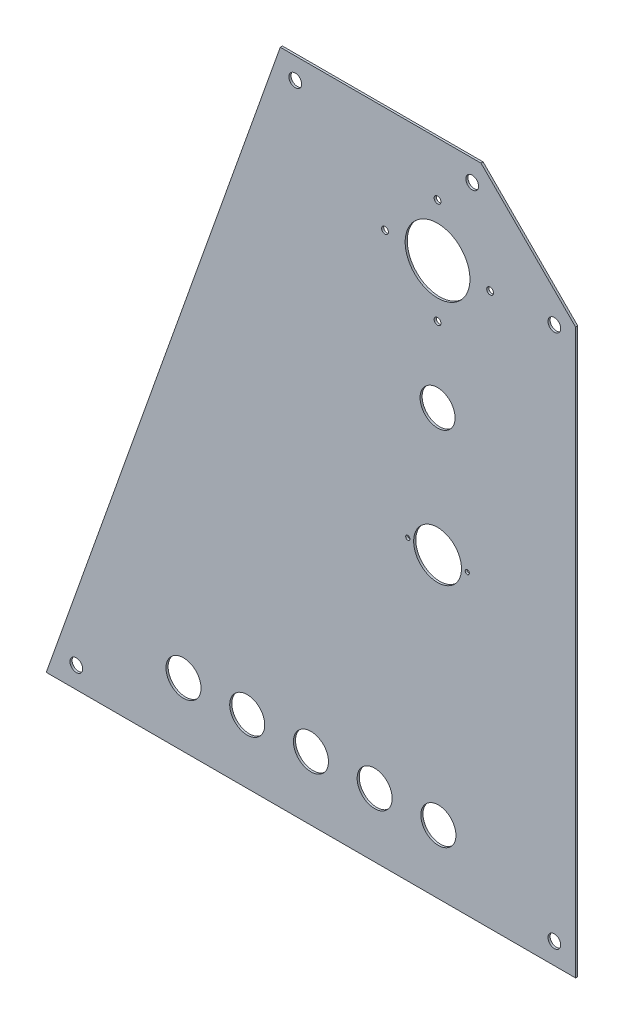
ISO-10303-21;
HEADER;
FILE_DESCRIPTION(('STEP AP214'),'2;1');
FILE_NAME('part.step','',(''),(''),'','','');
FILE_SCHEMA(('AUTOMOTIVE_DESIGN { 1 0 10303 214 1 1 1 1 }'));
ENDSEC;
DATA;
#1=APPLICATION_CONTEXT('core data for automotive mechanical design processes');
#2=APPLICATION_PROTOCOL_DEFINITION('international standard','automotive_design',2000,#1);
#3=PRODUCT_CONTEXT('',#1,'mechanical');
#4=PRODUCT('Part','Part','',(#3));
#5=PRODUCT_RELATED_PRODUCT_CATEGORY('part','',(#4));
#6=PRODUCT_DEFINITION_FORMATION('','',#4);
#7=PRODUCT_DEFINITION_CONTEXT('part definition',#1,'design');
#8=PRODUCT_DEFINITION('design','',#6,#7);
#9=PRODUCT_DEFINITION_SHAPE('','',#8);
#10=(LENGTH_UNIT() NAMED_UNIT(*) SI_UNIT(.MILLI.,.METRE.));
#11=(NAMED_UNIT(*) PLANE_ANGLE_UNIT() SI_UNIT($,.RADIAN.));
#12=(NAMED_UNIT(*) SI_UNIT($,.STERADIAN.) SOLID_ANGLE_UNIT());
#13=UNCERTAINTY_MEASURE_WITH_UNIT(LENGTH_MEASURE(1.E-05),#10,'distance_accuracy_value','');
#14=(GEOMETRIC_REPRESENTATION_CONTEXT(3) GLOBAL_UNCERTAINTY_ASSIGNED_CONTEXT((#13)) GLOBAL_UNIT_ASSIGNED_CONTEXT((#10,
#11,#12)) REPRESENTATION_CONTEXT('',''));
#15=CARTESIAN_POINT('',(0.,0.,0.));
#16=DIRECTION('',(0.,0.,1.));
#17=DIRECTION('',(1.,0.,0.));
#18=AXIS2_PLACEMENT_3D('',#15,#16,#17);
#19=CARTESIAN_POINT('',(125.,155.,1.));
#20=DIRECTION('',(0.,-1.,0.));
#21=DIRECTION('',(0.,0.,-1.));
#22=AXIS2_PLACEMENT_3D('',#19,#20,#21);
#23=PLANE('',#22);
#24=DIRECTION('',(-1.,0.,0.));
#25=VECTOR('',#24,1.);
#26=CARTESIAN_POINT('',(125.,155.,0.));
#27=LINE('',#26,#25);
#28=CARTESIAN_POINT('',(80.4522727852475,155.,0.));
#29=VERTEX_POINT('',#28);
#30=CARTESIAN_POINT('',(-14.0477272147525,155.,0.));
#31=VERTEX_POINT('',#30);
#32=EDGE_CURVE('E98',#29,#31,#27,.T.);
#33=ORIENTED_EDGE('',*,*,#32,.T.);
#34=DIRECTION('',(0.,0.,1.));
#35=VECTOR('',#34,1.);
#36=CARTESIAN_POINT('',(-14.0477272147525,155.,0.));
#37=LINE('',#36,#35);
#38=CARTESIAN_POINT('',(-14.0477272147525,155.,1.));
#39=VERTEX_POINT('',#38);
#40=EDGE_CURVE('E52',#31,#39,#37,.T.);
#41=ORIENTED_EDGE('',*,*,#40,.T.);
#42=DIRECTION('',(-1.,0.,0.));
#43=VECTOR('',#42,1.);
#44=CARTESIAN_POINT('',(125.,155.,1.));
#45=LINE('',#44,#43);
#46=CARTESIAN_POINT('',(80.4522727852475,155.,1.));
#47=VERTEX_POINT('',#46);
#48=EDGE_CURVE('E96',#47,#39,#45,.T.);
#49=ORIENTED_EDGE('',*,*,#48,.F.);
#50=DIRECTION('',(0.,0.,1.));
#51=VECTOR('',#50,1.);
#52=CARTESIAN_POINT('',(80.4522727852475,155.,0.));
#53=LINE('',#52,#51);
#54=EDGE_CURVE('E83',#29,#47,#53,.T.);
#55=ORIENTED_EDGE('',*,*,#54,.F.);
#56=EDGE_LOOP('',(#33,#41,#49,#55));
#57=FACE_BOUND('',#56,.T.);
#58=ADVANCED_FACE('F39',(#57),#23,.F.);
#59=CARTESIAN_POINT('',(125.,-155.,1.));
#60=DIRECTION('',(0.,1.,0.));
#61=DIRECTION('',(0.,0.,1.));
#62=AXIS2_PLACEMENT_3D('',#59,#60,#61);
#63=PLANE('',#62);
#64=DIRECTION('',(0.,0.,1.));
#65=VECTOR('',#64,1.);
#66=CARTESIAN_POINT('',(-124.233933247994,-155.,0.));
#67=LINE('',#66,#65);
#68=CARTESIAN_POINT('',(-124.233933247994,-155.,0.));
#69=VERTEX_POINT('',#68);
#70=CARTESIAN_POINT('',(-124.233933247994,-155.,1.));
#71=VERTEX_POINT('',#70);
#72=EDGE_CURVE('E114',#69,#71,#67,.T.);
#73=ORIENTED_EDGE('',*,*,#72,.F.);
#74=DIRECTION('',(1.,0.,0.));
#75=VECTOR('',#74,1.);
#76=CARTESIAN_POINT('',(125.,-155.,0.));
#77=LINE('',#76,#75);
#78=CARTESIAN_POINT('',(125.,-155.,0.));
#79=VERTEX_POINT('',#78);
#80=EDGE_CURVE('E105',#69,#79,#77,.T.);
#81=ORIENTED_EDGE('',*,*,#80,.T.);
#82=DIRECTION('',(0.,0.,-1.));
#83=VECTOR('',#82,1.);
#84=CARTESIAN_POINT('',(125.,-155.,1.));
#85=LINE('',#84,#83);
#86=CARTESIAN_POINT('',(125.,-155.,1.));
#87=VERTEX_POINT('',#86);
#88=EDGE_CURVE('E12',#87,#79,#85,.T.);
#89=ORIENTED_EDGE('',*,*,#88,.F.);
#90=DIRECTION('',(1.,0.,0.));
#91=VECTOR('',#90,1.);
#92=CARTESIAN_POINT('',(125.,-155.,1.));
#93=LINE('',#92,#91);
#94=EDGE_CURVE('E107',#71,#87,#93,.T.);
#95=ORIENTED_EDGE('',*,*,#94,.F.);
#96=EDGE_LOOP('',(#73,#81,#89,#95));
#97=FACE_BOUND('',#96,.T.);
#98=ADVANCED_FACE('F291',(#97),#63,.F.);
#99=CARTESIAN_POINT('',(125.,-155.,1.));
#100=DIRECTION('',(-1.,0.,0.));
#101=DIRECTION('',(0.,0.,1.));
#102=AXIS2_PLACEMENT_3D('',#99,#100,#101);
#103=PLANE('',#102);
#104=DIRECTION('',(0.,1.,0.));
#105=VECTOR('',#104,1.);
#106=CARTESIAN_POINT('',(125.,-155.,0.));
#107=LINE('',#106,#105);
#108=CARTESIAN_POINT('',(125.,110.452272785248,0.));
#109=VERTEX_POINT('',#108);
#110=EDGE_CURVE('E104',#79,#109,#107,.T.);
#111=ORIENTED_EDGE('',*,*,#110,.T.);
#112=DIRECTION('',(0.,0.,1.));
#113=VECTOR('',#112,1.);
#114=CARTESIAN_POINT('',(125.,110.452272785248,0.));
#115=LINE('',#114,#113);
#116=CARTESIAN_POINT('',(125.,110.452272785248,1.));
#117=VERTEX_POINT('',#116);
#118=EDGE_CURVE('E62',#109,#117,#115,.T.);
#119=ORIENTED_EDGE('',*,*,#118,.T.);
#120=DIRECTION('',(0.,1.,0.));
#121=VECTOR('',#120,1.);
#122=CARTESIAN_POINT('',(125.,-155.,1.));
#123=LINE('',#122,#121);
#124=EDGE_CURVE('E46',#87,#117,#123,.T.);
#125=ORIENTED_EDGE('',*,*,#124,.F.);
#126=ORIENTED_EDGE('',*,*,#88,.T.);
#127=EDGE_LOOP('',(#111,#119,#125,#126));
#128=FACE_BOUND('',#127,.T.);
#129=ADVANCED_FACE('F249',(#128),#103,.F.);
#130=CARTESIAN_POINT('',(0.,0.,1.));
#131=DIRECTION('',(0.,0.,-1.));
#132=DIRECTION('',(-1.,0.,0.));
#133=AXIS2_PLACEMENT_3D('',#130,#131,#132);
#134=PLANE('',#133);
#135=CARTESIAN_POINT('',(-110.06663627918,-145.,1.));
#136=DIRECTION('',(0.,0.,1.));
#137=DIRECTION('',(1.,0.,0.));
#138=AXIS2_PLACEMENT_3D('',#135,#136,#137);
#139=CIRCLE('',#138,2.99999999999999);
#140=CARTESIAN_POINT('',(-107.06663627918,-145.,1.));
#141=VERTEX_POINT('',#140);
#142=EDGE_CURVE('E235',#141,#141,#139,.T.);
#143=ORIENTED_EDGE('',*,*,#142,.F.);
#144=EDGE_LOOP('',(#143));
#145=FACE_BOUND('',#144,.T.);
#146=CARTESIAN_POINT('',(-6.98921773195385,145.,1.));
#147=DIRECTION('',(0.,0.,1.));
#148=DIRECTION('',(1.,0.,0.));
#149=AXIS2_PLACEMENT_3D('',#146,#147,#148);
#150=CIRCLE('',#149,2.99999999999999);
#151=CARTESIAN_POINT('',(-3.98921773195385,145.,1.));
#152=VERTEX_POINT('',#151);
#153=EDGE_CURVE('E230',#152,#152,#150,.T.);
#154=ORIENTED_EDGE('',*,*,#153,.F.);
#155=EDGE_LOOP('',(#154));
#156=FACE_BOUND('',#155,.T.);
#157=CARTESIAN_POINT('',(76.3101371615166,145.,1.));
#158=DIRECTION('',(0.,0.,1.));
#159=DIRECTION('',(1.,0.,0.));
#160=AXIS2_PLACEMENT_3D('',#157,#158,#159);
#161=CIRCLE('',#160,2.99999999999999);
#162=CARTESIAN_POINT('',(79.3101371615166,145.,1.));
#163=VERTEX_POINT('',#162);
#164=EDGE_CURVE('E223',#163,#163,#161,.T.);
#165=ORIENTED_EDGE('',*,*,#164,.F.);
#166=EDGE_LOOP('',(#165));
#167=FACE_BOUND('',#166,.T.);
#168=CARTESIAN_POINT('',(115.,-145.,1.));
#169=DIRECTION('',(0.,0.,1.));
#170=DIRECTION('',(1.,0.,0.));
#171=AXIS2_PLACEMENT_3D('',#168,#169,#170);
#172=CIRCLE('',#171,2.99999999999999);
#173=CARTESIAN_POINT('',(118.,-145.,1.));
#174=VERTEX_POINT('',#173);
#175=EDGE_CURVE('E216',#174,#174,#172,.T.);
#176=ORIENTED_EDGE('',*,*,#175,.F.);
#177=EDGE_LOOP('',(#176));
#178=FACE_BOUND('',#177,.T.);
#179=CARTESIAN_POINT('',(115.,106.310137161517,1.));
#180=DIRECTION('',(0.,0.,1.));
#181=DIRECTION('',(1.,0.,0.));
#182=AXIS2_PLACEMENT_3D('',#179,#180,#181);
#183=CIRCLE('',#182,3.00000000000001);
#184=CARTESIAN_POINT('',(118.,106.310137161517,1.));
#185=VERTEX_POINT('',#184);
#186=EDGE_CURVE('E212',#185,#185,#183,.T.);
#187=ORIENTED_EDGE('',*,*,#186,.F.);
#188=EDGE_LOOP('',(#187));
#189=FACE_BOUND('',#188,.T.);
#190=CARTESIAN_POINT('',(-59.6169666239971,-125.,1.));
#191=DIRECTION('',(0.,0.,1.));
#192=DIRECTION('',(1.,0.,0.));
#193=AXIS2_PLACEMENT_3D('',#190,#191,#192);
#194=CIRCLE('',#193,8.25);
#195=CARTESIAN_POINT('',(-51.3669666239971,-125.,1.));
#196=VERTEX_POINT('',#195);
#197=EDGE_CURVE('E203',#196,#196,#194,.T.);
#198=ORIENTED_EDGE('',*,*,#197,.F.);
#199=EDGE_LOOP('',(#198));
#200=FACE_BOUND('',#199,.T.);
#201=CARTESIAN_POINT('',(-29.6169666239971,-125.,1.));
#202=DIRECTION('',(0.,0.,1.));
#203=DIRECTION('',(1.,0.,0.));
#204=AXIS2_PLACEMENT_3D('',#201,#202,#203);
#205=CIRCLE('',#204,8.25);
#206=CARTESIAN_POINT('',(-21.3669666239971,-125.,1.));
#207=VERTEX_POINT('',#206);
#208=EDGE_CURVE('E197',#207,#207,#205,.T.);
#209=ORIENTED_EDGE('',*,*,#208,.F.);
#210=EDGE_LOOP('',(#209));
#211=FACE_BOUND('',#210,.T.);
#212=CARTESIAN_POINT('',(0.383033376002859,-125.,1.));
#213=DIRECTION('',(0.,0.,1.));
#214=DIRECTION('',(1.,0.,0.));
#215=AXIS2_PLACEMENT_3D('',#212,#213,#214);
#216=CIRCLE('',#215,8.25);
#217=CARTESIAN_POINT('',(8.63303337600286,-125.,1.));
#218=VERTEX_POINT('',#217);
#219=EDGE_CURVE('E191',#218,#218,#216,.T.);
#220=ORIENTED_EDGE('',*,*,#219,.F.);
#221=EDGE_LOOP('',(#220));
#222=FACE_BOUND('',#221,.T.);
#223=CARTESIAN_POINT('',(30.3830333760029,-125.,1.));
#224=DIRECTION('',(0.,0.,1.));
#225=DIRECTION('',(1.,0.,0.));
#226=AXIS2_PLACEMENT_3D('',#223,#224,#225);
#227=CIRCLE('',#226,8.25);
#228=CARTESIAN_POINT('',(38.6330333760028,-125.,1.));
#229=VERTEX_POINT('',#228);
#230=EDGE_CURVE('E189',#229,#229,#227,.T.);
#231=ORIENTED_EDGE('',*,*,#230,.F.);
#232=EDGE_LOOP('',(#231));
#233=FACE_BOUND('',#232,.T.);
#234=CARTESIAN_POINT('',(60.3830333760029,-125.,1.));
#235=DIRECTION('',(0.,0.,1.));
#236=DIRECTION('',(1.,0.,0.));
#237=AXIS2_PLACEMENT_3D('',#234,#235,#236);
#238=CIRCLE('',#237,8.25);
#239=CARTESIAN_POINT('',(68.6330333760029,-125.,1.));
#240=VERTEX_POINT('',#239);
#241=EDGE_CURVE('E181',#240,#240,#238,.T.);
#242=ORIENTED_EDGE('',*,*,#241,.F.);
#243=EDGE_LOOP('',(#242));
#244=FACE_BOUND('',#243,.T.);
#245=CARTESIAN_POINT('',(60.,45.,1.));
#246=DIRECTION('',(0.,0.,1.));
#247=DIRECTION('',(1.,0.,0.));
#248=AXIS2_PLACEMENT_3D('',#245,#246,#247);
#249=CIRCLE('',#248,8.25);
#250=CARTESIAN_POINT('',(68.25,45.,1.));
#251=VERTEX_POINT('',#250);
#252=EDGE_CURVE('E130',#251,#251,#249,.T.);
#253=ORIENTED_EDGE('',*,*,#252,.F.);
#254=EDGE_LOOP('',(#253));
#255=FACE_BOUND('',#254,.T.);
#256=CARTESIAN_POINT('',(60.,-15.,1.));
#257=DIRECTION('',(0.,0.,1.));
#258=DIRECTION('',(1.,0.,0.));
#259=AXIS2_PLACEMENT_3D('',#256,#257,#258);
#260=CIRCLE('',#259,11.25);
#261=CARTESIAN_POINT('',(71.25,-15.,1.));
#262=VERTEX_POINT('',#261);
#263=EDGE_CURVE('E147',#262,#262,#260,.T.);
#264=ORIENTED_EDGE('',*,*,#263,.F.);
#265=EDGE_LOOP('',(#264));
#266=FACE_BOUND('',#265,.T.);
#267=CARTESIAN_POINT('',(60.,129.748737341529,1.));
#268=DIRECTION('',(0.,0.,1.));
#269=DIRECTION('',(1.,0.,0.));
#270=AXIS2_PLACEMENT_3D('',#267,#268,#269);
#271=CIRCLE('',#270,1.59999999999999);
#272=CARTESIAN_POINT('',(61.6,129.748737341529,1.));
#273=VERTEX_POINT('',#272);
#274=EDGE_CURVE('E136',#273,#273,#271,.T.);
#275=ORIENTED_EDGE('',*,*,#274,.F.);
#276=EDGE_LOOP('',(#275));
#277=FACE_BOUND('',#276,.T.);
#278=CARTESIAN_POINT('',(84.7487373415291,105.,1.));
#279=DIRECTION('',(0.,0.,1.));
#280=DIRECTION('',(1.,0.,0.));
#281=AXIS2_PLACEMENT_3D('',#278,#279,#280);
#282=CIRCLE('',#281,1.59999999999993);
#283=CARTESIAN_POINT('',(86.348737341529,105.,1.));
#284=VERTEX_POINT('',#283);
#285=EDGE_CURVE('E135',#284,#284,#282,.T.);
#286=ORIENTED_EDGE('',*,*,#285,.F.);
#287=EDGE_LOOP('',(#286));
#288=FACE_BOUND('',#287,.T.);
#289=CARTESIAN_POINT('',(35.2512626584709,105.,1.));
#290=DIRECTION('',(0.,0.,1.));
#291=DIRECTION('',(1.,0.,0.));
#292=AXIS2_PLACEMENT_3D('',#289,#290,#291);
#293=CIRCLE('',#292,1.60000000000001);
#294=CARTESIAN_POINT('',(36.8512626584709,105.,1.));
#295=VERTEX_POINT('',#294);
#296=EDGE_CURVE('E133',#295,#295,#293,.T.);
#297=ORIENTED_EDGE('',*,*,#296,.F.);
#298=EDGE_LOOP('',(#297));
#299=FACE_BOUND('',#298,.T.);
#300=CARTESIAN_POINT('',(59.9999999999999,80.2512626584708,1.));
#301=DIRECTION('',(0.,0.,1.));
#302=DIRECTION('',(1.,0.,0.));
#303=AXIS2_PLACEMENT_3D('',#300,#301,#302);
#304=CIRCLE('',#303,1.60000000000006);
#305=CARTESIAN_POINT('',(61.6,80.2512626584708,1.));
#306=VERTEX_POINT('',#305);
#307=EDGE_CURVE('E167',#306,#306,#304,.T.);
#308=ORIENTED_EDGE('',*,*,#307,.F.);
#309=EDGE_LOOP('',(#308));
#310=FACE_BOUND('',#309,.T.);
#311=CARTESIAN_POINT('',(74.,-15.,1.));
#312=DIRECTION('',(0.,0.,1.));
#313=DIRECTION('',(1.,0.,0.));
#314=AXIS2_PLACEMENT_3D('',#311,#312,#313);
#315=CIRCLE('',#314,1.);
#316=CARTESIAN_POINT('',(75.,-15.,1.));
#317=VERTEX_POINT('',#316);
#318=EDGE_CURVE('E165',#317,#317,#315,.T.);
#319=ORIENTED_EDGE('',*,*,#318,.F.);
#320=EDGE_LOOP('',(#319));
#321=FACE_BOUND('',#320,.T.);
#322=CARTESIAN_POINT('',(46.,-15.,1.));
#323=DIRECTION('',(0.,0.,1.));
#324=DIRECTION('',(1.,0.,0.));
#325=AXIS2_PLACEMENT_3D('',#322,#323,#324);
#326=CIRCLE('',#325,1.);
#327=CARTESIAN_POINT('',(47.,-15.,1.));
#328=VERTEX_POINT('',#327);
#329=EDGE_CURVE('E160',#328,#328,#326,.T.);
#330=ORIENTED_EDGE('',*,*,#329,.F.);
#331=EDGE_LOOP('',(#330));
#332=FACE_BOUND('',#331,.T.);
#333=CARTESIAN_POINT('',(60.,105.,1.));
#334=DIRECTION('',(0.,0.,1.));
#335=DIRECTION('',(1.,0.,0.));
#336=AXIS2_PLACEMENT_3D('',#333,#334,#335);
#337=CIRCLE('',#336,15.25);
#338=CARTESIAN_POINT('',(75.25,105.,1.));
#339=VERTEX_POINT('',#338);
#340=EDGE_CURVE('E121',#339,#339,#337,.T.);
#341=ORIENTED_EDGE('',*,*,#340,.F.);
#342=EDGE_LOOP('',(#341));
#343=FACE_BOUND('',#342,.T.);
#344=ORIENTED_EDGE('',*,*,#124,.T.);
#345=DIRECTION('',(-0.707106781186547,0.707106781186547,0.));
#346=VECTOR('',#345,1.);
#347=CARTESIAN_POINT('',(125.,110.452272785248,1.));
#348=LINE('',#347,#346);
#349=EDGE_CURVE('E117',#117,#47,#348,.T.);
#350=ORIENTED_EDGE('',*,*,#349,.T.);
#351=ORIENTED_EDGE('',*,*,#48,.T.);
#352=DIRECTION('',(-0.3349124803442,-0.942249240121581,0.));
#353=VECTOR('',#352,1.);
#354=CARTESIAN_POINT('',(-14.0477272147525,155.,1.));
#355=LINE('',#354,#353);
#356=EDGE_CURVE('E119',#39,#71,#355,.T.);
#357=ORIENTED_EDGE('',*,*,#356,.T.);
#358=ORIENTED_EDGE('',*,*,#94,.T.);
#359=EDGE_LOOP('',(#344,#350,#351,#357,#358));
#360=FACE_BOUND('',#359,.T.);
#361=ADVANCED_FACE('F250',(#145,#156,#167,#178,#189,#200,#211,#222,#233,#244,#255,#266,#277,
#288,#299,#310,#321,#332,#343,#360),#134,.F.);
#362=CARTESIAN_POINT('',(0.,0.,0.));
#363=DIRECTION('',(0.,0.,-1.));
#364=DIRECTION('',(-1.,0.,0.));
#365=AXIS2_PLACEMENT_3D('',#362,#363,#364);
#366=PLANE('',#365);
#367=CARTESIAN_POINT('',(-110.06663627918,-145.,0.));
#368=DIRECTION('',(0.,0.,1.));
#369=DIRECTION('',(1.,0.,0.));
#370=AXIS2_PLACEMENT_3D('',#367,#368,#369);
#371=CIRCLE('',#370,2.99999999999999);
#372=CARTESIAN_POINT('',(-107.06663627918,-145.,0.));
#373=VERTEX_POINT('',#372);
#374=EDGE_CURVE('E185',#373,#373,#371,.T.);
#375=ORIENTED_EDGE('',*,*,#374,.T.);
#376=EDGE_LOOP('',(#375));
#377=FACE_BOUND('',#376,.T.);
#378=CARTESIAN_POINT('',(-6.98921773195385,145.,0.));
#379=DIRECTION('',(0.,0.,1.));
#380=DIRECTION('',(1.,0.,0.));
#381=AXIS2_PLACEMENT_3D('',#378,#379,#380);
#382=CIRCLE('',#381,2.99999999999999);
#383=CARTESIAN_POINT('',(-3.98921773195385,145.,0.));
#384=VERTEX_POINT('',#383);
#385=EDGE_CURVE('E228',#384,#384,#382,.T.);
#386=ORIENTED_EDGE('',*,*,#385,.T.);
#387=EDGE_LOOP('',(#386));
#388=FACE_BOUND('',#387,.T.);
#389=CARTESIAN_POINT('',(76.3101371615166,145.,0.));
#390=DIRECTION('',(0.,0.,1.));
#391=DIRECTION('',(1.,0.,0.));
#392=AXIS2_PLACEMENT_3D('',#389,#390,#391);
#393=CIRCLE('',#392,2.99999999999999);
#394=CARTESIAN_POINT('',(79.3101371615166,145.,0.));
#395=VERTEX_POINT('',#394);
#396=EDGE_CURVE('E217',#395,#395,#393,.T.);
#397=ORIENTED_EDGE('',*,*,#396,.T.);
#398=EDGE_LOOP('',(#397));
#399=FACE_BOUND('',#398,.T.);
#400=CARTESIAN_POINT('',(115.,-145.,0.));
#401=DIRECTION('',(0.,0.,1.));
#402=DIRECTION('',(1.,0.,0.));
#403=AXIS2_PLACEMENT_3D('',#400,#401,#402);
#404=CIRCLE('',#403,2.99999999999999);
#405=CARTESIAN_POINT('',(118.,-145.,0.));
#406=VERTEX_POINT('',#405);
#407=EDGE_CURVE('E211',#406,#406,#404,.T.);
#408=ORIENTED_EDGE('',*,*,#407,.T.);
#409=EDGE_LOOP('',(#408));
#410=FACE_BOUND('',#409,.T.);
#411=CARTESIAN_POINT('',(115.,106.310137161517,0.));
#412=DIRECTION('',(0.,0.,1.));
#413=DIRECTION('',(1.,0.,0.));
#414=AXIS2_PLACEMENT_3D('',#411,#412,#413);
#415=CIRCLE('',#414,3.00000000000001);
#416=CARTESIAN_POINT('',(118.,106.310137161517,0.));
#417=VERTEX_POINT('',#416);
#418=EDGE_CURVE('E206',#417,#417,#415,.T.);
#419=ORIENTED_EDGE('',*,*,#418,.T.);
#420=EDGE_LOOP('',(#419));
#421=FACE_BOUND('',#420,.T.);
#422=CARTESIAN_POINT('',(-59.6169666239971,-125.,0.));
#423=DIRECTION('',(0.,0.,1.));
#424=DIRECTION('',(1.,0.,0.));
#425=AXIS2_PLACEMENT_3D('',#422,#423,#424);
#426=CIRCLE('',#425,8.25);
#427=CARTESIAN_POINT('',(-51.3669666239971,-125.,0.));
#428=VERTEX_POINT('',#427);
#429=EDGE_CURVE('E158',#428,#428,#426,.T.);
#430=ORIENTED_EDGE('',*,*,#429,.T.);
#431=EDGE_LOOP('',(#430));
#432=FACE_BOUND('',#431,.T.);
#433=CARTESIAN_POINT('',(-29.6169666239971,-125.,0.));
#434=DIRECTION('',(0.,0.,1.));
#435=DIRECTION('',(1.,0.,0.));
#436=AXIS2_PLACEMENT_3D('',#433,#434,#435);
#437=CIRCLE('',#436,8.25);
#438=CARTESIAN_POINT('',(-21.3669666239971,-125.,0.));
#439=VERTEX_POINT('',#438);
#440=EDGE_CURVE('E196',#439,#439,#437,.T.);
#441=ORIENTED_EDGE('',*,*,#440,.T.);
#442=EDGE_LOOP('',(#441));
#443=FACE_BOUND('',#442,.T.);
#444=CARTESIAN_POINT('',(0.383033376002859,-125.,0.));
#445=DIRECTION('',(0.,0.,1.));
#446=DIRECTION('',(1.,0.,0.));
#447=AXIS2_PLACEMENT_3D('',#444,#445,#446);
#448=CIRCLE('',#447,8.25);
#449=CARTESIAN_POINT('',(8.63303337600286,-125.,0.));
#450=VERTEX_POINT('',#449);
#451=EDGE_CURVE('E192',#450,#450,#448,.T.);
#452=ORIENTED_EDGE('',*,*,#451,.T.);
#453=EDGE_LOOP('',(#452));
#454=FACE_BOUND('',#453,.T.);
#455=CARTESIAN_POINT('',(30.3830333760029,-125.,0.));
#456=DIRECTION('',(0.,0.,1.));
#457=DIRECTION('',(1.,0.,0.));
#458=AXIS2_PLACEMENT_3D('',#455,#456,#457);
#459=CIRCLE('',#458,8.25);
#460=CARTESIAN_POINT('',(38.6330333760028,-125.,0.));
#461=VERTEX_POINT('',#460);
#462=EDGE_CURVE('E184',#461,#461,#459,.T.);
#463=ORIENTED_EDGE('',*,*,#462,.T.);
#464=EDGE_LOOP('',(#463));
#465=FACE_BOUND('',#464,.T.);
#466=CARTESIAN_POINT('',(60.3830333760029,-125.,0.));
#467=DIRECTION('',(0.,0.,1.));
#468=DIRECTION('',(1.,0.,0.));
#469=AXIS2_PLACEMENT_3D('',#466,#467,#468);
#470=CIRCLE('',#469,8.25);
#471=CARTESIAN_POINT('',(68.6330333760029,-125.,0.));
#472=VERTEX_POINT('',#471);
#473=EDGE_CURVE('E178',#472,#472,#470,.T.);
#474=ORIENTED_EDGE('',*,*,#473,.T.);
#475=EDGE_LOOP('',(#474));
#476=FACE_BOUND('',#475,.T.);
#477=CARTESIAN_POINT('',(60.,45.,0.));
#478=DIRECTION('',(0.,0.,1.));
#479=DIRECTION('',(1.,0.,0.));
#480=AXIS2_PLACEMENT_3D('',#477,#478,#479);
#481=CIRCLE('',#480,8.25);
#482=CARTESIAN_POINT('',(68.25,45.,0.));
#483=VERTEX_POINT('',#482);
#484=EDGE_CURVE('E146',#483,#483,#481,.T.);
#485=ORIENTED_EDGE('',*,*,#484,.T.);
#486=EDGE_LOOP('',(#485));
#487=FACE_BOUND('',#486,.T.);
#488=CARTESIAN_POINT('',(60.,-15.,0.));
#489=DIRECTION('',(0.,0.,1.));
#490=DIRECTION('',(1.,0.,0.));
#491=AXIS2_PLACEMENT_3D('',#488,#489,#490);
#492=CIRCLE('',#491,11.25);
#493=CARTESIAN_POINT('',(71.25,-15.,0.));
#494=VERTEX_POINT('',#493);
#495=EDGE_CURVE('E141',#494,#494,#492,.T.);
#496=ORIENTED_EDGE('',*,*,#495,.T.);
#497=EDGE_LOOP('',(#496));
#498=FACE_BOUND('',#497,.T.);
#499=CARTESIAN_POINT('',(60.,129.748737341529,0.));
#500=DIRECTION('',(0.,0.,1.));
#501=DIRECTION('',(1.,0.,0.));
#502=AXIS2_PLACEMENT_3D('',#499,#500,#501);
#503=CIRCLE('',#502,1.59999999999999);
#504=CARTESIAN_POINT('',(61.6,129.748737341529,0.));
#505=VERTEX_POINT('',#504);
#506=EDGE_CURVE('E140',#505,#505,#503,.T.);
#507=ORIENTED_EDGE('',*,*,#506,.T.);
#508=EDGE_LOOP('',(#507));
#509=FACE_BOUND('',#508,.T.);
#510=CARTESIAN_POINT('',(84.7487373415291,105.,0.));
#511=DIRECTION('',(0.,0.,1.));
#512=DIRECTION('',(1.,0.,0.));
#513=AXIS2_PLACEMENT_3D('',#510,#511,#512);
#514=CIRCLE('',#513,1.59999999999993);
#515=CARTESIAN_POINT('',(86.348737341529,105.,0.));
#516=VERTEX_POINT('',#515);
#517=EDGE_CURVE('E128',#516,#516,#514,.T.);
#518=ORIENTED_EDGE('',*,*,#517,.T.);
#519=EDGE_LOOP('',(#518));
#520=FACE_BOUND('',#519,.T.);
#521=CARTESIAN_POINT('',(35.2512626584709,105.,0.));
#522=DIRECTION('',(0.,0.,1.));
#523=DIRECTION('',(1.,0.,0.));
#524=AXIS2_PLACEMENT_3D('',#521,#522,#523);
#525=CIRCLE('',#524,1.60000000000001);
#526=CARTESIAN_POINT('',(36.8512626584709,105.,0.));
#527=VERTEX_POINT('',#526);
#528=EDGE_CURVE('E173',#527,#527,#525,.T.);
#529=ORIENTED_EDGE('',*,*,#528,.T.);
#530=EDGE_LOOP('',(#529));
#531=FACE_BOUND('',#530,.T.);
#532=CARTESIAN_POINT('',(59.9999999999999,80.2512626584708,0.));
#533=DIRECTION('',(0.,0.,1.));
#534=DIRECTION('',(1.,0.,0.));
#535=AXIS2_PLACEMENT_3D('',#532,#533,#534);
#536=CIRCLE('',#535,1.60000000000006);
#537=CARTESIAN_POINT('',(61.6,80.2512626584708,0.));
#538=VERTEX_POINT('',#537);
#539=EDGE_CURVE('E170',#538,#538,#536,.T.);
#540=ORIENTED_EDGE('',*,*,#539,.T.);
#541=EDGE_LOOP('',(#540));
#542=FACE_BOUND('',#541,.T.);
#543=CARTESIAN_POINT('',(74.,-15.,0.));
#544=DIRECTION('',(0.,0.,1.));
#545=DIRECTION('',(1.,0.,0.));
#546=AXIS2_PLACEMENT_3D('',#543,#544,#545);
#547=CIRCLE('',#546,1.);
#548=CARTESIAN_POINT('',(75.,-15.,0.));
#549=VERTEX_POINT('',#548);
#550=EDGE_CURVE('E163',#549,#549,#547,.T.);
#551=ORIENTED_EDGE('',*,*,#550,.T.);
#552=EDGE_LOOP('',(#551));
#553=FACE_BOUND('',#552,.T.);
#554=CARTESIAN_POINT('',(46.,-15.,0.));
#555=DIRECTION('',(0.,0.,1.));
#556=DIRECTION('',(1.,0.,0.));
#557=AXIS2_PLACEMENT_3D('',#554,#555,#556);
#558=CIRCLE('',#557,1.);
#559=CARTESIAN_POINT('',(47.,-15.,0.));
#560=VERTEX_POINT('',#559);
#561=EDGE_CURVE('E153',#560,#560,#558,.T.);
#562=ORIENTED_EDGE('',*,*,#561,.T.);
#563=EDGE_LOOP('',(#562));
#564=FACE_BOUND('',#563,.T.);
#565=CARTESIAN_POINT('',(60.,105.,0.));
#566=DIRECTION('',(0.,0.,1.));
#567=DIRECTION('',(1.,0.,0.));
#568=AXIS2_PLACEMENT_3D('',#565,#566,#567);
#569=CIRCLE('',#568,15.25);
#570=CARTESIAN_POINT('',(75.25,105.,0.));
#571=VERTEX_POINT('',#570);
#572=EDGE_CURVE('E122',#571,#571,#569,.T.);
#573=ORIENTED_EDGE('',*,*,#572,.T.);
#574=EDGE_LOOP('',(#573));
#575=FACE_BOUND('',#574,.T.);
#576=DIRECTION('',(-0.707106781186547,0.707106781186547,0.));
#577=VECTOR('',#576,1.);
#578=CARTESIAN_POINT('',(125.,110.452272785248,0.));
#579=LINE('',#578,#577);
#580=EDGE_CURVE('E85',#109,#29,#579,.T.);
#581=ORIENTED_EDGE('',*,*,#580,.F.);
#582=ORIENTED_EDGE('',*,*,#110,.F.);
#583=ORIENTED_EDGE('',*,*,#80,.F.);
#584=DIRECTION('',(-0.3349124803442,-0.942249240121581,0.));
#585=VECTOR('',#584,1.);
#586=CARTESIAN_POINT('',(-14.0477272147525,155.,0.));
#587=LINE('',#586,#585);
#588=EDGE_CURVE('E92',#31,#69,#587,.T.);
#589=ORIENTED_EDGE('',*,*,#588,.F.);
#590=ORIENTED_EDGE('',*,*,#32,.F.);
#591=EDGE_LOOP('',(#581,#582,#583,#589,#590));
#592=FACE_BOUND('',#591,.T.);
#593=ADVANCED_FACE('F99',(#377,#388,#399,#410,#421,#432,#443,#454,#465,#476,#487,#498,#509,#520,
#531,#542,#553,#564,#575,#592),#366,.T.);
#594=CARTESIAN_POINT('',(-14.0477272147525,155.,0.));
#595=DIRECTION('',(-0.942249240121581,0.3349124803442,0.));
#596=DIRECTION('',(-0.3349124803442,-0.942249240121581,0.));
#597=AXIS2_PLACEMENT_3D('',#594,#595,#596);
#598=PLANE('',#597);
#599=ORIENTED_EDGE('',*,*,#356,.F.);
#600=ORIENTED_EDGE('',*,*,#40,.F.);
#601=ORIENTED_EDGE('',*,*,#588,.T.);
#602=ORIENTED_EDGE('',*,*,#72,.T.);
#603=EDGE_LOOP('',(#599,#600,#601,#602));
#604=FACE_BOUND('',#603,.T.);
#605=ADVANCED_FACE('F295',(#604),#598,.T.);
#606=CARTESIAN_POINT('',(125.,110.452272785248,0.));
#607=DIRECTION('',(0.707106781186547,0.707106781186547,0.));
#608=DIRECTION('',(-0.707106781186548,0.707106781186548,0.));
#609=AXIS2_PLACEMENT_3D('',#606,#607,#608);
#610=PLANE('',#609);
#611=ORIENTED_EDGE('',*,*,#349,.F.);
#612=ORIENTED_EDGE('',*,*,#118,.F.);
#613=ORIENTED_EDGE('',*,*,#580,.T.);
#614=ORIENTED_EDGE('',*,*,#54,.T.);
#615=EDGE_LOOP('',(#611,#612,#613,#614));
#616=FACE_BOUND('',#615,.T.);
#617=ADVANCED_FACE('F81',(#616),#610,.T.);
#618=CARTESIAN_POINT('',(60.,105.,0.));
#619=DIRECTION('',(0.,0.,1.));
#620=DIRECTION('',(1.,0.,0.));
#621=AXIS2_PLACEMENT_3D('',#618,#619,#620);
#622=CYLINDRICAL_SURFACE('',#621,15.25);
#623=ORIENTED_EDGE('',*,*,#572,.F.);
#624=EDGE_LOOP('',(#623));
#625=FACE_BOUND('',#624,.T.);
#626=ORIENTED_EDGE('',*,*,#340,.T.);
#627=EDGE_LOOP('',(#626));
#628=FACE_BOUND('',#627,.T.);
#629=ADVANCED_FACE('F301',(#625,#628),#622,.F.);
#630=CARTESIAN_POINT('',(46.,-15.,0.));
#631=DIRECTION('',(0.,0.,1.));
#632=DIRECTION('',(1.,0.,0.));
#633=AXIS2_PLACEMENT_3D('',#630,#631,#632);
#634=CYLINDRICAL_SURFACE('',#633,1.);
#635=ORIENTED_EDGE('',*,*,#561,.F.);
#636=EDGE_LOOP('',(#635));
#637=FACE_BOUND('',#636,.T.);
#638=ORIENTED_EDGE('',*,*,#329,.T.);
#639=EDGE_LOOP('',(#638));
#640=FACE_BOUND('',#639,.T.);
#641=ADVANCED_FACE('F358',(#637,#640),#634,.F.);
#642=CARTESIAN_POINT('',(74.,-15.,0.));
#643=DIRECTION('',(0.,0.,1.));
#644=DIRECTION('',(1.,0.,0.));
#645=AXIS2_PLACEMENT_3D('',#642,#643,#644);
#646=CYLINDRICAL_SURFACE('',#645,1.);
#647=ORIENTED_EDGE('',*,*,#550,.F.);
#648=EDGE_LOOP('',(#647));
#649=FACE_BOUND('',#648,.T.);
#650=ORIENTED_EDGE('',*,*,#318,.T.);
#651=EDGE_LOOP('',(#650));
#652=FACE_BOUND('',#651,.T.);
#653=ADVANCED_FACE('F366',(#649,#652),#646,.F.);
#654=CARTESIAN_POINT('',(59.9999999999999,80.2512626584708,0.));
#655=DIRECTION('',(0.,0.,1.));
#656=DIRECTION('',(1.,0.,0.));
#657=AXIS2_PLACEMENT_3D('',#654,#655,#656);
#658=CYLINDRICAL_SURFACE('',#657,1.60000000000006);
#659=ORIENTED_EDGE('',*,*,#539,.F.);
#660=EDGE_LOOP('',(#659));
#661=FACE_BOUND('',#660,.T.);
#662=ORIENTED_EDGE('',*,*,#307,.T.);
#663=EDGE_LOOP('',(#662));
#664=FACE_BOUND('',#663,.T.);
#665=ADVANCED_FACE('F376',(#661,#664),#658,.F.);
#666=CARTESIAN_POINT('',(35.2512626584709,105.,0.));
#667=DIRECTION('',(0.,0.,1.));
#668=DIRECTION('',(1.,0.,0.));
#669=AXIS2_PLACEMENT_3D('',#666,#667,#668);
#670=CYLINDRICAL_SURFACE('',#669,1.60000000000001);
#671=ORIENTED_EDGE('',*,*,#528,.F.);
#672=EDGE_LOOP('',(#671));
#673=FACE_BOUND('',#672,.T.);
#674=ORIENTED_EDGE('',*,*,#296,.T.);
#675=EDGE_LOOP('',(#674));
#676=FACE_BOUND('',#675,.T.);
#677=ADVANCED_FACE('F387',(#673,#676),#670,.F.);
#678=CARTESIAN_POINT('',(84.7487373415291,105.,0.));
#679=DIRECTION('',(0.,0.,1.));
#680=DIRECTION('',(1.,0.,0.));
#681=AXIS2_PLACEMENT_3D('',#678,#679,#680);
#682=CYLINDRICAL_SURFACE('',#681,1.59999999999993);
#683=ORIENTED_EDGE('',*,*,#517,.F.);
#684=EDGE_LOOP('',(#683));
#685=FACE_BOUND('',#684,.T.);
#686=ORIENTED_EDGE('',*,*,#285,.T.);
#687=EDGE_LOOP('',(#686));
#688=FACE_BOUND('',#687,.T.);
#689=ADVANCED_FACE('F397',(#685,#688),#682,.F.);
#690=CARTESIAN_POINT('',(60.,129.748737341529,0.));
#691=DIRECTION('',(0.,0.,1.));
#692=DIRECTION('',(1.,0.,0.));
#693=AXIS2_PLACEMENT_3D('',#690,#691,#692);
#694=CYLINDRICAL_SURFACE('',#693,1.59999999999999);
#695=ORIENTED_EDGE('',*,*,#506,.F.);
#696=EDGE_LOOP('',(#695));
#697=FACE_BOUND('',#696,.T.);
#698=ORIENTED_EDGE('',*,*,#274,.T.);
#699=EDGE_LOOP('',(#698));
#700=FACE_BOUND('',#699,.T.);
#701=ADVANCED_FACE('F407',(#697,#700),#694,.F.);
#702=CARTESIAN_POINT('',(60.,-15.,0.));
#703=DIRECTION('',(0.,0.,1.));
#704=DIRECTION('',(1.,0.,0.));
#705=AXIS2_PLACEMENT_3D('',#702,#703,#704);
#706=CYLINDRICAL_SURFACE('',#705,11.25);
#707=ORIENTED_EDGE('',*,*,#495,.F.);
#708=EDGE_LOOP('',(#707));
#709=FACE_BOUND('',#708,.T.);
#710=ORIENTED_EDGE('',*,*,#263,.T.);
#711=EDGE_LOOP('',(#710));
#712=FACE_BOUND('',#711,.T.);
#713=ADVANCED_FACE('F417',(#709,#712),#706,.F.);
#714=CARTESIAN_POINT('',(60.,45.,0.));
#715=DIRECTION('',(0.,0.,1.));
#716=DIRECTION('',(1.,0.,0.));
#717=AXIS2_PLACEMENT_3D('',#714,#715,#716);
#718=CYLINDRICAL_SURFACE('',#717,8.25);
#719=ORIENTED_EDGE('',*,*,#484,.F.);
#720=EDGE_LOOP('',(#719));
#721=FACE_BOUND('',#720,.T.);
#722=ORIENTED_EDGE('',*,*,#252,.T.);
#723=EDGE_LOOP('',(#722));
#724=FACE_BOUND('',#723,.T.);
#725=ADVANCED_FACE('F428',(#721,#724),#718,.F.);
#726=CARTESIAN_POINT('',(60.3830333760029,-125.,0.));
#727=DIRECTION('',(0.,0.,1.));
#728=DIRECTION('',(1.,0.,0.));
#729=AXIS2_PLACEMENT_3D('',#726,#727,#728);
#730=CYLINDRICAL_SURFACE('',#729,8.25);
#731=ORIENTED_EDGE('',*,*,#473,.F.);
#732=EDGE_LOOP('',(#731));
#733=FACE_BOUND('',#732,.T.);
#734=ORIENTED_EDGE('',*,*,#241,.T.);
#735=EDGE_LOOP('',(#734));
#736=FACE_BOUND('',#735,.T.);
#737=ADVANCED_FACE('F436',(#733,#736),#730,.F.);
#738=CARTESIAN_POINT('',(30.3830333760029,-125.,0.));
#739=DIRECTION('',(0.,0.,1.));
#740=DIRECTION('',(1.,0.,0.));
#741=AXIS2_PLACEMENT_3D('',#738,#739,#740);
#742=CYLINDRICAL_SURFACE('',#741,8.25);
#743=ORIENTED_EDGE('',*,*,#462,.F.);
#744=EDGE_LOOP('',(#743));
#745=FACE_BOUND('',#744,.T.);
#746=ORIENTED_EDGE('',*,*,#230,.T.);
#747=EDGE_LOOP('',(#746));
#748=FACE_BOUND('',#747,.T.);
#749=ADVANCED_FACE('F447',(#745,#748),#742,.F.);
#750=CARTESIAN_POINT('',(0.383033376002859,-125.,0.));
#751=DIRECTION('',(0.,0.,1.));
#752=DIRECTION('',(1.,0.,0.));
#753=AXIS2_PLACEMENT_3D('',#750,#751,#752);
#754=CYLINDRICAL_SURFACE('',#753,8.25);
#755=ORIENTED_EDGE('',*,*,#451,.F.);
#756=EDGE_LOOP('',(#755));
#757=FACE_BOUND('',#756,.T.);
#758=ORIENTED_EDGE('',*,*,#219,.T.);
#759=EDGE_LOOP('',(#758));
#760=FACE_BOUND('',#759,.T.);
#761=ADVANCED_FACE('F459',(#757,#760),#754,.F.);
#762=CARTESIAN_POINT('',(-29.6169666239971,-125.,0.));
#763=DIRECTION('',(0.,0.,1.));
#764=DIRECTION('',(1.,0.,0.));
#765=AXIS2_PLACEMENT_3D('',#762,#763,#764);
#766=CYLINDRICAL_SURFACE('',#765,8.25);
#767=ORIENTED_EDGE('',*,*,#440,.F.);
#768=EDGE_LOOP('',(#767));
#769=FACE_BOUND('',#768,.T.);
#770=ORIENTED_EDGE('',*,*,#208,.T.);
#771=EDGE_LOOP('',(#770));
#772=FACE_BOUND('',#771,.T.);
#773=ADVANCED_FACE('F467',(#769,#772),#766,.F.);
#774=CARTESIAN_POINT('',(-59.6169666239971,-125.,0.));
#775=DIRECTION('',(0.,0.,1.));
#776=DIRECTION('',(1.,0.,0.));
#777=AXIS2_PLACEMENT_3D('',#774,#775,#776);
#778=CYLINDRICAL_SURFACE('',#777,8.25);
#779=ORIENTED_EDGE('',*,*,#429,.F.);
#780=EDGE_LOOP('',(#779));
#781=FACE_BOUND('',#780,.T.);
#782=ORIENTED_EDGE('',*,*,#197,.T.);
#783=EDGE_LOOP('',(#782));
#784=FACE_BOUND('',#783,.T.);
#785=ADVANCED_FACE('F479',(#781,#784),#778,.F.);
#786=CARTESIAN_POINT('',(115.,106.310137161517,0.));
#787=DIRECTION('',(0.,0.,1.));
#788=DIRECTION('',(1.,0.,0.));
#789=AXIS2_PLACEMENT_3D('',#786,#787,#788);
#790=CYLINDRICAL_SURFACE('',#789,3.00000000000001);
#791=ORIENTED_EDGE('',*,*,#418,.F.);
#792=EDGE_LOOP('',(#791));
#793=FACE_BOUND('',#792,.T.);
#794=ORIENTED_EDGE('',*,*,#186,.T.);
#795=EDGE_LOOP('',(#794));
#796=FACE_BOUND('',#795,.T.);
#797=ADVANCED_FACE('F481',(#793,#796),#790,.F.);
#798=CARTESIAN_POINT('',(115.,-145.,0.));
#799=DIRECTION('',(0.,0.,1.));
#800=DIRECTION('',(1.,0.,0.));
#801=AXIS2_PLACEMENT_3D('',#798,#799,#800);
#802=CYLINDRICAL_SURFACE('',#801,2.99999999999999);
#803=ORIENTED_EDGE('',*,*,#407,.F.);
#804=EDGE_LOOP('',(#803));
#805=FACE_BOUND('',#804,.T.);
#806=ORIENTED_EDGE('',*,*,#175,.T.);
#807=EDGE_LOOP('',(#806));
#808=FACE_BOUND('',#807,.T.);
#809=ADVANCED_FACE('F494',(#805,#808),#802,.F.);
#810=CARTESIAN_POINT('',(76.3101371615166,145.,0.));
#811=DIRECTION('',(0.,0.,1.));
#812=DIRECTION('',(1.,0.,0.));
#813=AXIS2_PLACEMENT_3D('',#810,#811,#812);
#814=CYLINDRICAL_SURFACE('',#813,2.99999999999999);
#815=ORIENTED_EDGE('',*,*,#396,.F.);
#816=EDGE_LOOP('',(#815));
#817=FACE_BOUND('',#816,.T.);
#818=ORIENTED_EDGE('',*,*,#164,.T.);
#819=EDGE_LOOP('',(#818));
#820=FACE_BOUND('',#819,.T.);
#821=ADVANCED_FACE('F502',(#817,#820),#814,.F.);
#822=CARTESIAN_POINT('',(-6.98921773195385,145.,0.));
#823=DIRECTION('',(0.,0.,1.));
#824=DIRECTION('',(1.,0.,0.));
#825=AXIS2_PLACEMENT_3D('',#822,#823,#824);
#826=CYLINDRICAL_SURFACE('',#825,2.99999999999999);
#827=ORIENTED_EDGE('',*,*,#385,.F.);
#828=EDGE_LOOP('',(#827));
#829=FACE_BOUND('',#828,.T.);
#830=ORIENTED_EDGE('',*,*,#153,.T.);
#831=EDGE_LOOP('',(#830));
#832=FACE_BOUND('',#831,.T.);
#833=ADVANCED_FACE('F243',(#829,#832),#826,.F.);
#834=CARTESIAN_POINT('',(-110.06663627918,-145.,0.));
#835=DIRECTION('',(0.,0.,1.));
#836=DIRECTION('',(1.,0.,0.));
#837=AXIS2_PLACEMENT_3D('',#834,#835,#836);
#838=CYLINDRICAL_SURFACE('',#837,2.99999999999999);
#839=ORIENTED_EDGE('',*,*,#374,.F.);
#840=EDGE_LOOP('',(#839));
#841=FACE_BOUND('',#840,.T.);
#842=ORIENTED_EDGE('',*,*,#142,.T.);
#843=EDGE_LOOP('',(#842));
#844=FACE_BOUND('',#843,.T.);
#845=ADVANCED_FACE('F239',(#841,#844),#838,.F.);
#846=CLOSED_SHELL('',(#58,#98,#129,#361,#593,#605,#617,#629,#641,#653,#665,#677,#689,#701,#713,
#725,#737,#749,#761,#773,#785,#797,#809,#821,#833,#845));
#847=MANIFOLD_SOLID_BREP('B2',#846);
#848=ADVANCED_BREP_SHAPE_REPRESENTATION('',(#18,#847),#14);
#849=SHAPE_DEFINITION_REPRESENTATION(#9,#848);
ENDSEC;
END-ISO-10303-21;
